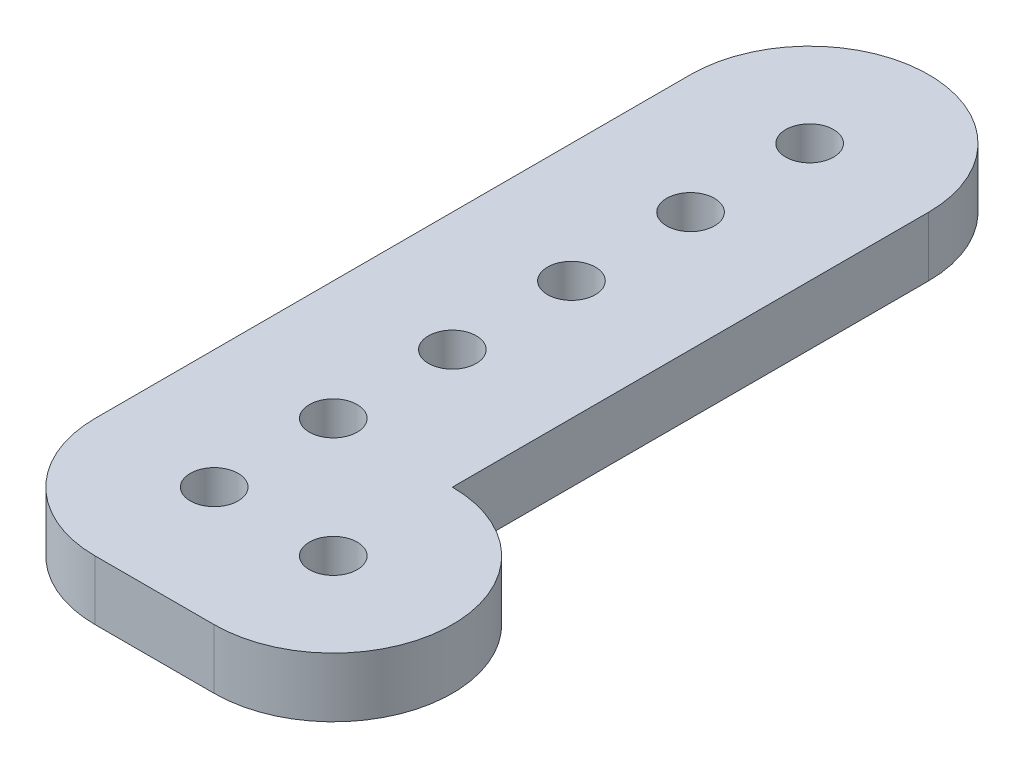
ISO-10303-21;
HEADER;
FILE_DESCRIPTION(('STEP AP214'),'2;1');
FILE_NAME('part.step','',(''),(''),'','','');
FILE_SCHEMA(('AUTOMOTIVE_DESIGN { 1 0 10303 214 1 1 1 1 }'));
ENDSEC;
DATA;
#1=APPLICATION_CONTEXT('core data for automotive mechanical design processes');
#2=APPLICATION_PROTOCOL_DEFINITION('international standard','automotive_design',2000,#1);
#3=PRODUCT_CONTEXT('',#1,'mechanical');
#4=PRODUCT('Part','Part','',(#3));
#5=PRODUCT_RELATED_PRODUCT_CATEGORY('part','',(#4));
#6=PRODUCT_DEFINITION_FORMATION('','',#4);
#7=PRODUCT_DEFINITION_CONTEXT('part definition',#1,'design');
#8=PRODUCT_DEFINITION('design','',#6,#7);
#9=PRODUCT_DEFINITION_SHAPE('','',#8);
#10=(LENGTH_UNIT() NAMED_UNIT(*) SI_UNIT(.MILLI.,.METRE.));
#11=(NAMED_UNIT(*) PLANE_ANGLE_UNIT() SI_UNIT($,.RADIAN.));
#12=(NAMED_UNIT(*) SI_UNIT($,.STERADIAN.) SOLID_ANGLE_UNIT());
#13=UNCERTAINTY_MEASURE_WITH_UNIT(LENGTH_MEASURE(1.E-05),#10,'distance_accuracy_value','');
#14=(GEOMETRIC_REPRESENTATION_CONTEXT(3) GLOBAL_UNCERTAINTY_ASSIGNED_CONTEXT((#13)) GLOBAL_UNIT_ASSIGNED_CONTEXT((#10,
#11,#12)) REPRESENTATION_CONTEXT('',''));
#15=CARTESIAN_POINT('',(0.,0.,0.));
#16=DIRECTION('',(0.,0.,1.));
#17=DIRECTION('',(1.,0.,0.));
#18=AXIS2_PLACEMENT_3D('',#15,#16,#17);
#19=CARTESIAN_POINT('',(-12.7,3.175,0.));
#20=DIRECTION('',(-1.,0.,0.));
#21=DIRECTION('',(0.,0.,1.));
#22=AXIS2_PLACEMENT_3D('',#19,#20,#21);
#23=PLANE('',#22);
#24=DIRECTION('',(0.,0.,-1.));
#25=VECTOR('',#24,1.);
#26=CARTESIAN_POINT('',(-12.7,-3.175,0.));
#27=LINE('',#26,#25);
#28=CARTESIAN_POINT('',(-12.7,-3.175,0.));
#29=VERTEX_POINT('',#28);
#30=CARTESIAN_POINT('',(-12.7,-3.175,-63.5));
#31=VERTEX_POINT('',#30);
#32=EDGE_CURVE('E137',#29,#31,#27,.T.);
#33=ORIENTED_EDGE('',*,*,#32,.F.);
#34=DIRECTION('',(0.,-1.,0.));
#35=VECTOR('',#34,1.);
#36=CARTESIAN_POINT('',(-12.7,3.175,0.));
#37=LINE('',#36,#35);
#38=CARTESIAN_POINT('',(-12.7,3.175,0.));
#39=VERTEX_POINT('',#38);
#40=EDGE_CURVE('E11',#39,#29,#37,.T.);
#41=ORIENTED_EDGE('',*,*,#40,.F.);
#42=DIRECTION('',(0.,0.,-1.));
#43=VECTOR('',#42,1.);
#44=CARTESIAN_POINT('',(-12.7,3.175,0.));
#45=LINE('',#44,#43);
#46=CARTESIAN_POINT('',(-12.7,3.175,-63.5));
#47=VERTEX_POINT('',#46);
#48=EDGE_CURVE('E171',#39,#47,#45,.T.);
#49=ORIENTED_EDGE('',*,*,#48,.T.);
#50=DIRECTION('',(0.,-1.,0.));
#51=VECTOR('',#50,1.);
#52=CARTESIAN_POINT('',(-12.7,3.175,-63.5));
#53=LINE('',#52,#51);
#54=EDGE_CURVE('E80',#47,#31,#53,.T.);
#55=ORIENTED_EDGE('',*,*,#54,.T.);
#56=EDGE_LOOP('',(#33,#41,#49,#55));
#57=FACE_BOUND('',#56,.T.);
#58=ADVANCED_FACE('F35',(#57),#23,.T.);
#59=CARTESIAN_POINT('',(0.,3.175,0.));
#60=DIRECTION('',(0.,-1.,0.));
#61=DIRECTION('',(0.,0.,-1.));
#62=AXIS2_PLACEMENT_3D('',#59,#60,#61);
#63=CYLINDRICAL_SURFACE('',#62,12.7);
#64=CARTESIAN_POINT('',(0.,-3.175,0.));
#65=DIRECTION('',(0.,1.,0.));
#66=DIRECTION('',(0.,0.,1.));
#67=AXIS2_PLACEMENT_3D('',#64,#65,#66);
#68=CIRCLE('',#67,12.7);
#69=CARTESIAN_POINT('',(0.,-3.175,12.7));
#70=VERTEX_POINT('',#69);
#71=EDGE_CURVE('E140',#29,#70,#68,.T.);
#72=ORIENTED_EDGE('',*,*,#71,.T.);
#73=DIRECTION('',(0.,-1.,0.));
#74=VECTOR('',#73,1.);
#75=CARTESIAN_POINT('',(0.,3.175,12.7));
#76=LINE('',#75,#74);
#77=CARTESIAN_POINT('',(0.,3.175,12.7));
#78=VERTEX_POINT('',#77);
#79=EDGE_CURVE('E43',#78,#70,#76,.T.);
#80=ORIENTED_EDGE('',*,*,#79,.F.);
#81=CARTESIAN_POINT('',(0.,3.175,0.));
#82=DIRECTION('',(0.,1.,0.));
#83=DIRECTION('',(0.,0.,1.));
#84=AXIS2_PLACEMENT_3D('',#81,#82,#83);
#85=CIRCLE('',#84,12.7);
#86=EDGE_CURVE('E187',#39,#78,#85,.T.);
#87=ORIENTED_EDGE('',*,*,#86,.F.);
#88=ORIENTED_EDGE('',*,*,#40,.T.);
#89=EDGE_LOOP('',(#72,#80,#87,#88));
#90=FACE_BOUND('',#89,.T.);
#91=ADVANCED_FACE('F180',(#90),#63,.T.);
#92=CARTESIAN_POINT('',(0.,3.175,12.7));
#93=DIRECTION('',(0.,0.,1.));
#94=DIRECTION('',(1.,0.,0.));
#95=AXIS2_PLACEMENT_3D('',#92,#93,#94);
#96=PLANE('',#95);
#97=DIRECTION('',(-1.,0.,0.));
#98=VECTOR('',#97,1.);
#99=CARTESIAN_POINT('',(0.,-3.175,12.7));
#100=LINE('',#99,#98);
#101=CARTESIAN_POINT('',(12.7,-3.175,12.7));
#102=VERTEX_POINT('',#101);
#103=EDGE_CURVE('E143',#102,#70,#100,.T.);
#104=ORIENTED_EDGE('',*,*,#103,.F.);
#105=DIRECTION('',(0.,-1.,0.));
#106=VECTOR('',#105,1.);
#107=CARTESIAN_POINT('',(12.7,3.175,12.7));
#108=LINE('',#107,#106);
#109=CARTESIAN_POINT('',(12.7,3.175,12.7));
#110=VERTEX_POINT('',#109);
#111=EDGE_CURVE('E108',#110,#102,#108,.T.);
#112=ORIENTED_EDGE('',*,*,#111,.F.);
#113=DIRECTION('',(-1.,0.,0.));
#114=VECTOR('',#113,1.);
#115=CARTESIAN_POINT('',(0.,3.175,12.7));
#116=LINE('',#115,#114);
#117=EDGE_CURVE('E101',#110,#78,#116,.T.);
#118=ORIENTED_EDGE('',*,*,#117,.T.);
#119=ORIENTED_EDGE('',*,*,#79,.T.);
#120=EDGE_LOOP('',(#104,#112,#118,#119));
#121=FACE_BOUND('',#120,.T.);
#122=ADVANCED_FACE('F177',(#121),#96,.T.);
#123=CARTESIAN_POINT('',(12.7,3.175,0.));
#124=DIRECTION('',(0.,-1.,0.));
#125=DIRECTION('',(0.,0.,-1.));
#126=AXIS2_PLACEMENT_3D('',#123,#124,#125);
#127=CYLINDRICAL_SURFACE('',#126,12.7);
#128=CARTESIAN_POINT('',(12.7,-3.175,0.));
#129=DIRECTION('',(0.,1.,0.));
#130=DIRECTION('',(0.,0.,1.));
#131=AXIS2_PLACEMENT_3D('',#128,#129,#130);
#132=CIRCLE('',#131,12.7);
#133=CARTESIAN_POINT('',(12.7,-3.175,-12.7));
#134=VERTEX_POINT('',#133);
#135=EDGE_CURVE('E107',#102,#134,#132,.T.);
#136=ORIENTED_EDGE('',*,*,#135,.T.);
#137=DIRECTION('',(0.,-1.,0.));
#138=VECTOR('',#137,1.);
#139=CARTESIAN_POINT('',(12.7,3.175,-12.7));
#140=LINE('',#139,#138);
#141=CARTESIAN_POINT('',(12.7,3.175,-12.7));
#142=VERTEX_POINT('',#141);
#143=EDGE_CURVE('E104',#142,#134,#140,.T.);
#144=ORIENTED_EDGE('',*,*,#143,.F.);
#145=CARTESIAN_POINT('',(12.7,3.175,0.));
#146=DIRECTION('',(0.,1.,0.));
#147=DIRECTION('',(0.,0.,1.));
#148=AXIS2_PLACEMENT_3D('',#145,#146,#147);
#149=CIRCLE('',#148,12.7);
#150=EDGE_CURVE('E94',#110,#142,#149,.T.);
#151=ORIENTED_EDGE('',*,*,#150,.F.);
#152=ORIENTED_EDGE('',*,*,#111,.T.);
#153=EDGE_LOOP('',(#136,#144,#151,#152));
#154=FACE_BOUND('',#153,.T.);
#155=ADVANCED_FACE('F105',(#154),#127,.T.);
#156=CARTESIAN_POINT('',(12.7,3.175,0.));
#157=DIRECTION('',(-1.,0.,0.));
#158=DIRECTION('',(0.,0.,1.));
#159=AXIS2_PLACEMENT_3D('',#156,#157,#158);
#160=PLANE('',#159);
#161=DIRECTION('',(0.,0.,-1.));
#162=VECTOR('',#161,1.);
#163=CARTESIAN_POINT('',(12.7,-3.175,0.));
#164=LINE('',#163,#162);
#165=CARTESIAN_POINT('',(12.7,-3.175,-63.5));
#166=VERTEX_POINT('',#165);
#167=EDGE_CURVE('E73',#134,#166,#164,.T.);
#168=ORIENTED_EDGE('',*,*,#167,.T.);
#169=DIRECTION('',(0.,-1.,0.));
#170=VECTOR('',#169,1.);
#171=CARTESIAN_POINT('',(12.7,3.175,-63.5));
#172=LINE('',#171,#170);
#173=CARTESIAN_POINT('',(12.7,3.175,-63.5));
#174=VERTEX_POINT('',#173);
#175=EDGE_CURVE('E109',#174,#166,#172,.T.);
#176=ORIENTED_EDGE('',*,*,#175,.F.);
#177=DIRECTION('',(0.,0.,-1.));
#178=VECTOR('',#177,1.);
#179=CARTESIAN_POINT('',(12.7,3.175,0.));
#180=LINE('',#179,#178);
#181=EDGE_CURVE('E99',#142,#174,#180,.T.);
#182=ORIENTED_EDGE('',*,*,#181,.F.);
#183=ORIENTED_EDGE('',*,*,#143,.T.);
#184=EDGE_LOOP('',(#168,#176,#182,#183));
#185=FACE_BOUND('',#184,.T.);
#186=ADVANCED_FACE('F111',(#185),#160,.F.);
#187=CARTESIAN_POINT('',(0.,3.175,-50.8));
#188=DIRECTION('',(0.,-1.,0.));
#189=DIRECTION('',(0.,0.,-1.));
#190=AXIS2_PLACEMENT_3D('',#187,#188,#189);
#191=CYLINDRICAL_SURFACE('',#190,2.5527);
#192=CARTESIAN_POINT('',(0.,3.175,-50.8));
#193=DIRECTION('',(0.,1.,0.));
#194=DIRECTION('',(0.,0.,1.));
#195=AXIS2_PLACEMENT_3D('',#192,#193,#194);
#196=CIRCLE('',#195,2.5527);
#197=CARTESIAN_POINT('',(0.,3.175,-48.2473));
#198=VERTEX_POINT('',#197);
#199=EDGE_CURVE('E131',#198,#198,#196,.T.);
#200=ORIENTED_EDGE('',*,*,#199,.T.);
#201=EDGE_LOOP('',(#200));
#202=FACE_BOUND('',#201,.T.);
#203=CARTESIAN_POINT('',(0.,-3.175,-50.8));
#204=DIRECTION('',(0.,1.,0.));
#205=DIRECTION('',(0.,0.,1.));
#206=AXIS2_PLACEMENT_3D('',#203,#204,#205);
#207=CIRCLE('',#206,2.5527);
#208=CARTESIAN_POINT('',(0.,-3.175,-48.2473));
#209=VERTEX_POINT('',#208);
#210=EDGE_CURVE('E165',#209,#209,#207,.T.);
#211=ORIENTED_EDGE('',*,*,#210,.F.);
#212=EDGE_LOOP('',(#211));
#213=FACE_BOUND('',#212,.T.);
#214=ADVANCED_FACE('F203',(#202,#213),#191,.F.);
#215=CARTESIAN_POINT('',(0.,3.175,-38.1));
#216=DIRECTION('',(0.,-1.,0.));
#217=DIRECTION('',(0.,0.,-1.));
#218=AXIS2_PLACEMENT_3D('',#215,#216,#217);
#219=CYLINDRICAL_SURFACE('',#218,2.5527);
#220=CARTESIAN_POINT('',(0.,3.175,-38.1));
#221=DIRECTION('',(0.,1.,0.));
#222=DIRECTION('',(0.,0.,1.));
#223=AXIS2_PLACEMENT_3D('',#220,#221,#222);
#224=CIRCLE('',#223,2.5527);
#225=CARTESIAN_POINT('',(0.,3.175,-35.5473));
#226=VERTEX_POINT('',#225);
#227=EDGE_CURVE('E128',#226,#226,#224,.T.);
#228=ORIENTED_EDGE('',*,*,#227,.T.);
#229=EDGE_LOOP('',(#228));
#230=FACE_BOUND('',#229,.T.);
#231=CARTESIAN_POINT('',(0.,-3.175,-38.1));
#232=DIRECTION('',(0.,1.,0.));
#233=DIRECTION('',(0.,0.,1.));
#234=AXIS2_PLACEMENT_3D('',#231,#232,#233);
#235=CIRCLE('',#234,2.5527);
#236=CARTESIAN_POINT('',(0.,-3.175,-35.5473));
#237=VERTEX_POINT('',#236);
#238=EDGE_CURVE('E162',#237,#237,#235,.T.);
#239=ORIENTED_EDGE('',*,*,#238,.F.);
#240=EDGE_LOOP('',(#239));
#241=FACE_BOUND('',#240,.T.);
#242=ADVANCED_FACE('F222',(#230,#241),#219,.F.);
#243=CARTESIAN_POINT('',(0.,3.175,-25.4));
#244=DIRECTION('',(0.,-1.,0.));
#245=DIRECTION('',(0.,0.,-1.));
#246=AXIS2_PLACEMENT_3D('',#243,#244,#245);
#247=CYLINDRICAL_SURFACE('',#246,2.5527);
#248=CARTESIAN_POINT('',(0.,3.175,-25.4));
#249=DIRECTION('',(0.,1.,0.));
#250=DIRECTION('',(0.,0.,1.));
#251=AXIS2_PLACEMENT_3D('',#248,#249,#250);
#252=CIRCLE('',#251,2.5527);
#253=CARTESIAN_POINT('',(0.,3.175,-22.8473));
#254=VERTEX_POINT('',#253);
#255=EDGE_CURVE('E125',#254,#254,#252,.T.);
#256=ORIENTED_EDGE('',*,*,#255,.T.);
#257=EDGE_LOOP('',(#256));
#258=FACE_BOUND('',#257,.T.);
#259=CARTESIAN_POINT('',(0.,-3.175,-25.4));
#260=DIRECTION('',(0.,1.,0.));
#261=DIRECTION('',(0.,0.,1.));
#262=AXIS2_PLACEMENT_3D('',#259,#260,#261);
#263=CIRCLE('',#262,2.5527);
#264=CARTESIAN_POINT('',(0.,-3.175,-22.8473));
#265=VERTEX_POINT('',#264);
#266=EDGE_CURVE('E159',#265,#265,#263,.T.);
#267=ORIENTED_EDGE('',*,*,#266,.F.);
#268=EDGE_LOOP('',(#267));
#269=FACE_BOUND('',#268,.T.);
#270=ADVANCED_FACE('F218',(#258,#269),#247,.F.);
#271=CARTESIAN_POINT('',(0.,3.175,0.));
#272=DIRECTION('',(0.,-1.,0.));
#273=DIRECTION('',(0.,0.,-1.));
#274=AXIS2_PLACEMENT_3D('',#271,#272,#273);
#275=CYLINDRICAL_SURFACE('',#274,2.5527);
#276=CARTESIAN_POINT('',(0.,3.175,0.));
#277=DIRECTION('',(0.,1.,0.));
#278=DIRECTION('',(0.,0.,1.));
#279=AXIS2_PLACEMENT_3D('',#276,#277,#278);
#280=CIRCLE('',#279,2.5527);
#281=CARTESIAN_POINT('',(0.,3.175,2.5527));
#282=VERTEX_POINT('',#281);
#283=EDGE_CURVE('E122',#282,#282,#280,.T.);
#284=ORIENTED_EDGE('',*,*,#283,.T.);
#285=EDGE_LOOP('',(#284));
#286=FACE_BOUND('',#285,.T.);
#287=CARTESIAN_POINT('',(0.,-3.175,0.));
#288=DIRECTION('',(0.,1.,0.));
#289=DIRECTION('',(0.,0.,1.));
#290=AXIS2_PLACEMENT_3D('',#287,#288,#289);
#291=CIRCLE('',#290,2.5527);
#292=CARTESIAN_POINT('',(0.,-3.175,2.5527));
#293=VERTEX_POINT('',#292);
#294=EDGE_CURVE('E156',#293,#293,#291,.T.);
#295=ORIENTED_EDGE('',*,*,#294,.F.);
#296=EDGE_LOOP('',(#295));
#297=FACE_BOUND('',#296,.T.);
#298=ADVANCED_FACE('F214',(#286,#297),#275,.F.);
#299=CARTESIAN_POINT('',(0.,3.175,-12.7));
#300=DIRECTION('',(0.,-1.,0.));
#301=DIRECTION('',(0.,0.,-1.));
#302=AXIS2_PLACEMENT_3D('',#299,#300,#301);
#303=CYLINDRICAL_SURFACE('',#302,2.5527);
#304=CARTESIAN_POINT('',(0.,3.175,-12.7));
#305=DIRECTION('',(0.,1.,0.));
#306=DIRECTION('',(0.,0.,1.));
#307=AXIS2_PLACEMENT_3D('',#304,#305,#306);
#308=CIRCLE('',#307,2.5527);
#309=CARTESIAN_POINT('',(0.,3.175,-10.1473));
#310=VERTEX_POINT('',#309);
#311=EDGE_CURVE('E119',#310,#310,#308,.T.);
#312=ORIENTED_EDGE('',*,*,#311,.T.);
#313=EDGE_LOOP('',(#312));
#314=FACE_BOUND('',#313,.T.);
#315=CARTESIAN_POINT('',(0.,-3.175,-12.7));
#316=DIRECTION('',(0.,1.,0.));
#317=DIRECTION('',(0.,0.,1.));
#318=AXIS2_PLACEMENT_3D('',#315,#316,#317);
#319=CIRCLE('',#318,2.5527);
#320=CARTESIAN_POINT('',(0.,-3.175,-10.1473));
#321=VERTEX_POINT('',#320);
#322=EDGE_CURVE('E153',#321,#321,#319,.T.);
#323=ORIENTED_EDGE('',*,*,#322,.F.);
#324=EDGE_LOOP('',(#323));
#325=FACE_BOUND('',#324,.T.);
#326=ADVANCED_FACE('F210',(#314,#325),#303,.F.);
#327=CARTESIAN_POINT('',(12.7,3.175,0.));
#328=DIRECTION('',(0.,-1.,0.));
#329=DIRECTION('',(0.,0.,-1.));
#330=AXIS2_PLACEMENT_3D('',#327,#328,#329);
#331=CYLINDRICAL_SURFACE('',#330,2.5527);
#332=CARTESIAN_POINT('',(12.7,3.175,0.));
#333=DIRECTION('',(0.,1.,0.));
#334=DIRECTION('',(0.,0.,1.));
#335=AXIS2_PLACEMENT_3D('',#332,#333,#334);
#336=CIRCLE('',#335,2.5527);
#337=CARTESIAN_POINT('',(12.7,3.175,2.5527));
#338=VERTEX_POINT('',#337);
#339=EDGE_CURVE('E113',#338,#338,#336,.T.);
#340=ORIENTED_EDGE('',*,*,#339,.T.);
#341=EDGE_LOOP('',(#340));
#342=FACE_BOUND('',#341,.T.);
#343=CARTESIAN_POINT('',(12.7,-3.175,0.));
#344=DIRECTION('',(0.,1.,0.));
#345=DIRECTION('',(0.,0.,1.));
#346=AXIS2_PLACEMENT_3D('',#343,#344,#345);
#347=CIRCLE('',#346,2.5527);
#348=CARTESIAN_POINT('',(12.7,-3.175,2.5527));
#349=VERTEX_POINT('',#348);
#350=EDGE_CURVE('E150',#349,#349,#347,.T.);
#351=ORIENTED_EDGE('',*,*,#350,.F.);
#352=EDGE_LOOP('',(#351));
#353=FACE_BOUND('',#352,.T.);
#354=ADVANCED_FACE('F207',(#342,#353),#331,.F.);
#355=CARTESIAN_POINT('',(0.,3.175,-63.5));
#356=DIRECTION('',(0.,-1.,0.));
#357=DIRECTION('',(0.,0.,-1.));
#358=AXIS2_PLACEMENT_3D('',#355,#356,#357);
#359=CYLINDRICAL_SURFACE('',#358,12.7);
#360=CARTESIAN_POINT('',(0.,-3.175,-63.5));
#361=DIRECTION('',(0.,1.,0.));
#362=DIRECTION('',(0.,0.,1.));
#363=AXIS2_PLACEMENT_3D('',#360,#361,#362);
#364=CIRCLE('',#363,12.7);
#365=EDGE_CURVE('E148',#166,#31,#364,.T.);
#366=ORIENTED_EDGE('',*,*,#365,.T.);
#367=ORIENTED_EDGE('',*,*,#54,.F.);
#368=CARTESIAN_POINT('',(0.,3.175,-63.5));
#369=DIRECTION('',(0.,1.,0.));
#370=DIRECTION('',(0.,0.,1.));
#371=AXIS2_PLACEMENT_3D('',#368,#369,#370);
#372=CIRCLE('',#371,12.7);
#373=EDGE_CURVE('E51',#174,#47,#372,.T.);
#374=ORIENTED_EDGE('',*,*,#373,.F.);
#375=ORIENTED_EDGE('',*,*,#175,.T.);
#376=EDGE_LOOP('',(#366,#367,#374,#375));
#377=FACE_BOUND('',#376,.T.);
#378=ADVANCED_FACE('F186',(#377),#359,.T.);
#379=CARTESIAN_POINT('',(0.,3.175,-63.5));
#380=DIRECTION('',(0.,-1.,0.));
#381=DIRECTION('',(0.,0.,-1.));
#382=AXIS2_PLACEMENT_3D('',#379,#380,#381);
#383=CYLINDRICAL_SURFACE('',#382,2.5527);
#384=CARTESIAN_POINT('',(0.,3.175,-63.5));
#385=DIRECTION('',(0.,1.,0.));
#386=DIRECTION('',(0.,0.,1.));
#387=AXIS2_PLACEMENT_3D('',#384,#385,#386);
#388=CIRCLE('',#387,2.5527);
#389=CARTESIAN_POINT('',(0.,3.175,-60.9473));
#390=VERTEX_POINT('',#389);
#391=EDGE_CURVE('E134',#390,#390,#388,.T.);
#392=ORIENTED_EDGE('',*,*,#391,.T.);
#393=EDGE_LOOP('',(#392));
#394=FACE_BOUND('',#393,.T.);
#395=CARTESIAN_POINT('',(0.,-3.175,-63.5));
#396=DIRECTION('',(0.,1.,0.));
#397=DIRECTION('',(0.,0.,1.));
#398=AXIS2_PLACEMENT_3D('',#395,#396,#397);
#399=CIRCLE('',#398,2.5527);
#400=CARTESIAN_POINT('',(0.,-3.175,-60.9473));
#401=VERTEX_POINT('',#400);
#402=EDGE_CURVE('E168',#401,#401,#399,.T.);
#403=ORIENTED_EDGE('',*,*,#402,.F.);
#404=EDGE_LOOP('',(#403));
#405=FACE_BOUND('',#404,.T.);
#406=ADVANCED_FACE('F206',(#394,#405),#383,.F.);
#407=CARTESIAN_POINT('',(0.,3.175,0.));
#408=DIRECTION('',(0.,1.,0.));
#409=DIRECTION('',(0.,0.,1.));
#410=AXIS2_PLACEMENT_3D('',#407,#408,#409);
#411=PLANE('',#410);
#412=ORIENTED_EDGE('',*,*,#48,.F.);
#413=ORIENTED_EDGE('',*,*,#86,.T.);
#414=ORIENTED_EDGE('',*,*,#117,.F.);
#415=ORIENTED_EDGE('',*,*,#150,.T.);
#416=ORIENTED_EDGE('',*,*,#181,.T.);
#417=ORIENTED_EDGE('',*,*,#373,.T.);
#418=EDGE_LOOP('',(#412,#413,#414,#415,#416,#417));
#419=FACE_BOUND('',#418,.T.);
#420=ORIENTED_EDGE('',*,*,#339,.F.);
#421=EDGE_LOOP('',(#420));
#422=FACE_BOUND('',#421,.T.);
#423=ORIENTED_EDGE('',*,*,#311,.F.);
#424=EDGE_LOOP('',(#423));
#425=FACE_BOUND('',#424,.T.);
#426=ORIENTED_EDGE('',*,*,#283,.F.);
#427=EDGE_LOOP('',(#426));
#428=FACE_BOUND('',#427,.T.);
#429=ORIENTED_EDGE('',*,*,#255,.F.);
#430=EDGE_LOOP('',(#429));
#431=FACE_BOUND('',#430,.T.);
#432=ORIENTED_EDGE('',*,*,#227,.F.);
#433=EDGE_LOOP('',(#432));
#434=FACE_BOUND('',#433,.T.);
#435=ORIENTED_EDGE('',*,*,#199,.F.);
#436=EDGE_LOOP('',(#435));
#437=FACE_BOUND('',#436,.T.);
#438=ORIENTED_EDGE('',*,*,#391,.F.);
#439=EDGE_LOOP('',(#438));
#440=FACE_BOUND('',#439,.T.);
#441=ADVANCED_FACE('F96',(#419,#422,#425,#428,#431,#434,#437,#440),#411,.T.);
#442=CARTESIAN_POINT('',(0.,-3.175,0.));
#443=DIRECTION('',(0.,1.,0.));
#444=DIRECTION('',(0.,0.,1.));
#445=AXIS2_PLACEMENT_3D('',#442,#443,#444);
#446=PLANE('',#445);
#447=ORIENTED_EDGE('',*,*,#32,.T.);
#448=ORIENTED_EDGE('',*,*,#365,.F.);
#449=ORIENTED_EDGE('',*,*,#167,.F.);
#450=ORIENTED_EDGE('',*,*,#135,.F.);
#451=ORIENTED_EDGE('',*,*,#103,.T.);
#452=ORIENTED_EDGE('',*,*,#71,.F.);
#453=EDGE_LOOP('',(#447,#448,#449,#450,#451,#452));
#454=FACE_BOUND('',#453,.T.);
#455=ORIENTED_EDGE('',*,*,#350,.T.);
#456=EDGE_LOOP('',(#455));
#457=FACE_BOUND('',#456,.T.);
#458=ORIENTED_EDGE('',*,*,#322,.T.);
#459=EDGE_LOOP('',(#458));
#460=FACE_BOUND('',#459,.T.);
#461=ORIENTED_EDGE('',*,*,#294,.T.);
#462=EDGE_LOOP('',(#461));
#463=FACE_BOUND('',#462,.T.);
#464=ORIENTED_EDGE('',*,*,#266,.T.);
#465=EDGE_LOOP('',(#464));
#466=FACE_BOUND('',#465,.T.);
#467=ORIENTED_EDGE('',*,*,#238,.T.);
#468=EDGE_LOOP('',(#467));
#469=FACE_BOUND('',#468,.T.);
#470=ORIENTED_EDGE('',*,*,#210,.T.);
#471=EDGE_LOOP('',(#470));
#472=FACE_BOUND('',#471,.T.);
#473=ORIENTED_EDGE('',*,*,#402,.T.);
#474=EDGE_LOOP('',(#473));
#475=FACE_BOUND('',#474,.T.);
#476=ADVANCED_FACE('F182',(#454,#457,#460,#463,#466,#469,#472,#475),#446,.F.);
#477=CLOSED_SHELL('',(#58,#91,#122,#155,#186,#214,#242,#270,#298,#326,#354,#378,#406,#441,#476));
#478=MANIFOLD_SOLID_BREP('B2',#477);
#479=ADVANCED_BREP_SHAPE_REPRESENTATION('',(#18,#478),#14);
#480=SHAPE_DEFINITION_REPRESENTATION(#9,#479);
ENDSEC;
END-ISO-10303-21;
